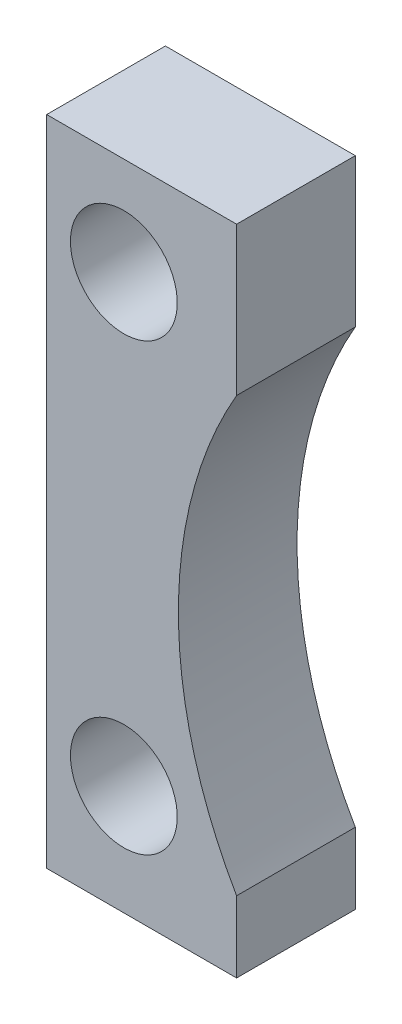
ISO-10303-21;
HEADER;
FILE_DESCRIPTION(('STEP AP214'),'2;1');
FILE_NAME('part.step','',(''),(''),'','','');
FILE_SCHEMA(('AUTOMOTIVE_DESIGN { 1 0 10303 214 1 1 1 1 }'));
ENDSEC;
DATA;
#1=APPLICATION_CONTEXT('core data for automotive mechanical design processes');
#2=APPLICATION_PROTOCOL_DEFINITION('international standard','automotive_design',2000,#1);
#3=PRODUCT_CONTEXT('',#1,'mechanical');
#4=PRODUCT('Part','Part','',(#3));
#5=PRODUCT_RELATED_PRODUCT_CATEGORY('part','',(#4));
#6=PRODUCT_DEFINITION_FORMATION('','',#4);
#7=PRODUCT_DEFINITION_CONTEXT('part definition',#1,'design');
#8=PRODUCT_DEFINITION('design','',#6,#7);
#9=PRODUCT_DEFINITION_SHAPE('','',#8);
#10=(LENGTH_UNIT() NAMED_UNIT(*) SI_UNIT(.MILLI.,.METRE.));
#11=(NAMED_UNIT(*) PLANE_ANGLE_UNIT() SI_UNIT($,.RADIAN.));
#12=(NAMED_UNIT(*) SI_UNIT($,.STERADIAN.) SOLID_ANGLE_UNIT());
#13=UNCERTAINTY_MEASURE_WITH_UNIT(LENGTH_MEASURE(1.E-05),#10,'distance_accuracy_value','');
#14=(GEOMETRIC_REPRESENTATION_CONTEXT(3) GLOBAL_UNCERTAINTY_ASSIGNED_CONTEXT((#13)) GLOBAL_UNIT_ASSIGNED_CONTEXT((#10,
#11,#12)) REPRESENTATION_CONTEXT('',''));
#15=CARTESIAN_POINT('',(0.,0.,0.));
#16=DIRECTION('',(0.,0.,1.));
#17=DIRECTION('',(1.,0.,0.));
#18=AXIS2_PLACEMENT_3D('',#15,#16,#17);
#19=CARTESIAN_POINT('',(0.,110.,10.));
#20=DIRECTION('',(1.,0.,0.));
#21=DIRECTION('',(0.,1.,0.));
#22=AXIS2_PLACEMENT_3D('',#19,#20,#21);
#23=PLANE('',#22);
#24=DIRECTION('',(0.,-1.,0.));
#25=VECTOR('',#24,1.);
#26=CARTESIAN_POINT('',(0.,110.,-10.));
#27=LINE('',#26,#25);
#28=CARTESIAN_POINT('',(0.,110.,-10.));
#29=VERTEX_POINT('',#28);
#30=CARTESIAN_POINT('',(0.,0.,-10.));
#31=VERTEX_POINT('',#30);
#32=EDGE_CURVE('E121',#29,#31,#27,.T.);
#33=ORIENTED_EDGE('',*,*,#32,.T.);
#34=DIRECTION('',(0.,0.,-1.));
#35=VECTOR('',#34,1.);
#36=CARTESIAN_POINT('',(0.,0.,10.));
#37=LINE('',#36,#35);
#38=CARTESIAN_POINT('',(0.,0.,10.));
#39=VERTEX_POINT('',#38);
#40=EDGE_CURVE('E11',#39,#31,#37,.T.);
#41=ORIENTED_EDGE('',*,*,#40,.F.);
#42=DIRECTION('',(0.,-1.,0.));
#43=VECTOR('',#42,1.);
#44=CARTESIAN_POINT('',(0.,110.,10.));
#45=LINE('',#44,#43);
#46=CARTESIAN_POINT('',(0.,110.,10.));
#47=VERTEX_POINT('',#46);
#48=EDGE_CURVE('E132',#47,#39,#45,.T.);
#49=ORIENTED_EDGE('',*,*,#48,.F.);
#50=DIRECTION('',(0.,0.,-1.));
#51=VECTOR('',#50,1.);
#52=CARTESIAN_POINT('',(0.,110.,10.));
#53=LINE('',#52,#51);
#54=EDGE_CURVE('E117',#47,#29,#53,.T.);
#55=ORIENTED_EDGE('',*,*,#54,.T.);
#56=EDGE_LOOP('',(#33,#41,#49,#55));
#57=FACE_BOUND('',#56,.T.);
#58=ADVANCED_FACE('F37',(#57),#23,.F.);
#59=CARTESIAN_POINT('',(0.,0.,10.));
#60=DIRECTION('',(0.,1.,0.));
#61=DIRECTION('',(0.,0.,1.));
#62=AXIS2_PLACEMENT_3D('',#59,#60,#61);
#63=PLANE('',#62);
#64=DIRECTION('',(1.,0.,0.));
#65=VECTOR('',#64,1.);
#66=CARTESIAN_POINT('',(0.,0.,-10.));
#67=LINE('',#66,#65);
#68=CARTESIAN_POINT('',(32.,0.,-10.));
#69=VERTEX_POINT('',#68);
#70=EDGE_CURVE('E124',#31,#69,#67,.T.);
#71=ORIENTED_EDGE('',*,*,#70,.T.);
#72=DIRECTION('',(0.,0.,-1.));
#73=VECTOR('',#72,1.);
#74=CARTESIAN_POINT('',(32.,0.,10.));
#75=LINE('',#74,#73);
#76=CARTESIAN_POINT('',(32.,0.,10.));
#77=VERTEX_POINT('',#76);
#78=EDGE_CURVE('E45',#77,#69,#75,.T.);
#79=ORIENTED_EDGE('',*,*,#78,.F.);
#80=DIRECTION('',(1.,0.,0.));
#81=VECTOR('',#80,1.);
#82=CARTESIAN_POINT('',(0.,0.,10.));
#83=LINE('',#82,#81);
#84=EDGE_CURVE('E90',#39,#77,#83,.T.);
#85=ORIENTED_EDGE('',*,*,#84,.F.);
#86=ORIENTED_EDGE('',*,*,#40,.T.);
#87=EDGE_LOOP('',(#71,#79,#85,#86));
#88=FACE_BOUND('',#87,.T.);
#89=ADVANCED_FACE('F157',(#88),#63,.F.);
#90=CARTESIAN_POINT('',(32.,12.,10.));
#91=DIRECTION('',(-1.,0.,0.));
#92=DIRECTION('',(0.,-1.,0.));
#93=AXIS2_PLACEMENT_3D('',#90,#91,#92);
#94=PLANE('',#93);
#95=DIRECTION('',(0.,1.,0.));
#96=VECTOR('',#95,1.);
#97=CARTESIAN_POINT('',(32.,12.,-10.));
#98=LINE('',#97,#96);
#99=CARTESIAN_POINT('',(32.,12.,-10.));
#100=VERTEX_POINT('',#99);
#101=EDGE_CURVE('E127',#69,#100,#98,.T.);
#102=ORIENTED_EDGE('',*,*,#101,.T.);
#103=DIRECTION('',(0.,0.,-1.));
#104=VECTOR('',#103,1.);
#105=CARTESIAN_POINT('',(32.,12.,10.));
#106=LINE('',#105,#104);
#107=CARTESIAN_POINT('',(32.,12.,10.));
#108=VERTEX_POINT('',#107);
#109=EDGE_CURVE('E112',#108,#100,#106,.T.);
#110=ORIENTED_EDGE('',*,*,#109,.F.);
#111=DIRECTION('',(0.,1.,0.));
#112=VECTOR('',#111,1.);
#113=CARTESIAN_POINT('',(32.,12.,10.));
#114=LINE('',#113,#112);
#115=EDGE_CURVE('E103',#77,#108,#114,.T.);
#116=ORIENTED_EDGE('',*,*,#115,.F.);
#117=ORIENTED_EDGE('',*,*,#78,.T.);
#118=EDGE_LOOP('',(#102,#110,#116,#117));
#119=FACE_BOUND('',#118,.T.);
#120=ADVANCED_FACE('F138',(#119),#94,.F.);
#121=CARTESIAN_POINT('',(95.000000000003,48.5,10.));
#122=DIRECTION('',(0.,0.,-1.));
#123=DIRECTION('',(-1.,0.,0.));
#124=AXIS2_PLACEMENT_3D('',#121,#122,#123);
#125=CYLINDRICAL_SURFACE('',#124,72.8096834219211);
#126=CARTESIAN_POINT('',(95.000000000003,48.5,-10.));
#127=DIRECTION('',(0.,0.,-1.));
#128=DIRECTION('',(1.,0.,0.));
#129=AXIS2_PLACEMENT_3D('',#126,#127,#128);
#130=CIRCLE('',#129,72.8096834219211);
#131=CARTESIAN_POINT('',(32.,85.,-10.));
#132=VERTEX_POINT('',#131);
#133=EDGE_CURVE('E111',#100,#132,#130,.T.);
#134=ORIENTED_EDGE('',*,*,#133,.T.);
#135=DIRECTION('',(0.,0.,-1.));
#136=VECTOR('',#135,1.);
#137=CARTESIAN_POINT('',(32.,85.,10.));
#138=LINE('',#137,#136);
#139=CARTESIAN_POINT('',(32.,85.,10.));
#140=VERTEX_POINT('',#139);
#141=EDGE_CURVE('E108',#140,#132,#138,.T.);
#142=ORIENTED_EDGE('',*,*,#141,.F.);
#143=CARTESIAN_POINT('',(95.000000000003,48.5,10.));
#144=DIRECTION('',(0.,0.,-1.));
#145=DIRECTION('',(1.,0.,0.));
#146=AXIS2_PLACEMENT_3D('',#143,#144,#145);
#147=CIRCLE('',#146,72.8096834219211);
#148=EDGE_CURVE('E97',#108,#140,#147,.T.);
#149=ORIENTED_EDGE('',*,*,#148,.F.);
#150=ORIENTED_EDGE('',*,*,#109,.T.);
#151=EDGE_LOOP('',(#134,#142,#149,#150));
#152=FACE_BOUND('',#151,.T.);
#153=ADVANCED_FACE('F109',(#152),#125,.F.);
#154=CARTESIAN_POINT('',(32.,110.,10.));
#155=DIRECTION('',(-1.,0.,0.));
#156=DIRECTION('',(0.,-1.,0.));
#157=AXIS2_PLACEMENT_3D('',#154,#155,#156);
#158=PLANE('',#157);
#159=DIRECTION('',(0.,1.,0.));
#160=VECTOR('',#159,1.);
#161=CARTESIAN_POINT('',(32.,110.,-10.));
#162=LINE('',#161,#160);
#163=CARTESIAN_POINT('',(32.,110.,-10.));
#164=VERTEX_POINT('',#163);
#165=EDGE_CURVE('E76',#132,#164,#162,.T.);
#166=ORIENTED_EDGE('',*,*,#165,.T.);
#167=DIRECTION('',(0.,0.,-1.));
#168=VECTOR('',#167,1.);
#169=CARTESIAN_POINT('',(32.,110.,10.));
#170=LINE('',#169,#168);
#171=CARTESIAN_POINT('',(32.,110.,10.));
#172=VERTEX_POINT('',#171);
#173=EDGE_CURVE('E113',#172,#164,#170,.T.);
#174=ORIENTED_EDGE('',*,*,#173,.F.);
#175=DIRECTION('',(0.,1.,0.));
#176=VECTOR('',#175,1.);
#177=CARTESIAN_POINT('',(32.,110.,10.));
#178=LINE('',#177,#176);
#179=EDGE_CURVE('E101',#140,#172,#178,.T.);
#180=ORIENTED_EDGE('',*,*,#179,.F.);
#181=ORIENTED_EDGE('',*,*,#141,.T.);
#182=EDGE_LOOP('',(#166,#174,#180,#181));
#183=FACE_BOUND('',#182,.T.);
#184=ADVANCED_FACE('F115',(#183),#158,.F.);
#185=CARTESIAN_POINT('',(0.,110.,10.));
#186=DIRECTION('',(0.,-1.,0.));
#187=DIRECTION('',(0.,0.,-1.));
#188=AXIS2_PLACEMENT_3D('',#185,#186,#187);
#189=PLANE('',#188);
#190=DIRECTION('',(-1.,0.,0.));
#191=VECTOR('',#190,1.);
#192=CARTESIAN_POINT('',(0.,110.,-10.));
#193=LINE('',#192,#191);
#194=EDGE_CURVE('E82',#164,#29,#193,.T.);
#195=ORIENTED_EDGE('',*,*,#194,.T.);
#196=ORIENTED_EDGE('',*,*,#54,.F.);
#197=DIRECTION('',(-1.,0.,0.));
#198=VECTOR('',#197,1.);
#199=CARTESIAN_POINT('',(0.,110.,10.));
#200=LINE('',#199,#198);
#201=EDGE_CURVE('E53',#172,#47,#200,.T.);
#202=ORIENTED_EDGE('',*,*,#201,.F.);
#203=ORIENTED_EDGE('',*,*,#173,.T.);
#204=EDGE_LOOP('',(#195,#196,#202,#203));
#205=FACE_BOUND('',#204,.T.);
#206=ADVANCED_FACE('F145',(#205),#189,.F.);
#207=CARTESIAN_POINT('',(95.000000000003,48.5,10.));
#208=DIRECTION('',(0.,0.,1.));
#209=DIRECTION('',(1.,0.,0.));
#210=AXIS2_PLACEMENT_3D('',#207,#208,#209);
#211=PLANE('',#210);
#212=CARTESIAN_POINT('',(13.000000000003,93.4999999999999,10.));
#213=DIRECTION('',(0.,0.,-1.));
#214=DIRECTION('',(-1.,0.,0.));
#215=AXIS2_PLACEMENT_3D('',#212,#213,#214);
#216=CIRCLE('',#215,9.00000000000002);
#217=CARTESIAN_POINT('',(4.000000000003,93.4999999999999,10.));
#218=VERTEX_POINT('',#217);
#219=EDGE_CURVE('E125',#218,#218,#216,.T.);
#220=ORIENTED_EDGE('',*,*,#219,.T.);
#221=EDGE_LOOP('',(#220));
#222=FACE_BOUND('',#221,.T.);
#223=CARTESIAN_POINT('',(13.000000000003,18.4999999999999,10.));
#224=DIRECTION('',(0.,0.,-1.));
#225=DIRECTION('',(-1.,0.,0.));
#226=AXIS2_PLACEMENT_3D('',#223,#224,#225);
#227=CIRCLE('',#226,9.);
#228=CARTESIAN_POINT('',(4.00000000000302,18.4999999999999,10.));
#229=VERTEX_POINT('',#228);
#230=EDGE_CURVE('E223',#229,#229,#227,.T.);
#231=ORIENTED_EDGE('',*,*,#230,.T.);
#232=EDGE_LOOP('',(#231));
#233=FACE_BOUND('',#232,.T.);
#234=ORIENTED_EDGE('',*,*,#48,.T.);
#235=ORIENTED_EDGE('',*,*,#84,.T.);
#236=ORIENTED_EDGE('',*,*,#115,.T.);
#237=ORIENTED_EDGE('',*,*,#148,.T.);
#238=ORIENTED_EDGE('',*,*,#179,.T.);
#239=ORIENTED_EDGE('',*,*,#201,.T.);
#240=EDGE_LOOP('',(#234,#235,#236,#237,#238,#239));
#241=FACE_BOUND('',#240,.T.);
#242=ADVANCED_FACE('F99',(#222,#233,#241),#211,.T.);
#243=CARTESIAN_POINT('',(95.000000000003,48.5,-10.));
#244=DIRECTION('',(0.,0.,1.));
#245=DIRECTION('',(1.,0.,0.));
#246=AXIS2_PLACEMENT_3D('',#243,#244,#245);
#247=PLANE('',#246);
#248=CARTESIAN_POINT('',(13.000000000003,93.4999999999999,-10.));
#249=DIRECTION('',(0.,0.,-1.));
#250=DIRECTION('',(-1.,0.,0.));
#251=AXIS2_PLACEMENT_3D('',#248,#249,#250);
#252=CIRCLE('',#251,9.00000000000002);
#253=CARTESIAN_POINT('',(4.000000000003,93.4999999999999,-10.));
#254=VERTEX_POINT('',#253);
#255=EDGE_CURVE('E222',#254,#254,#252,.T.);
#256=ORIENTED_EDGE('',*,*,#255,.F.);
#257=EDGE_LOOP('',(#256));
#258=FACE_BOUND('',#257,.T.);
#259=CARTESIAN_POINT('',(13.000000000003,18.4999999999999,-10.));
#260=DIRECTION('',(0.,0.,-1.));
#261=DIRECTION('',(-1.,0.,0.));
#262=AXIS2_PLACEMENT_3D('',#259,#260,#261);
#263=CIRCLE('',#262,9.);
#264=CARTESIAN_POINT('',(4.00000000000302,18.4999999999999,-10.));
#265=VERTEX_POINT('',#264);
#266=EDGE_CURVE('E227',#265,#265,#263,.T.);
#267=ORIENTED_EDGE('',*,*,#266,.F.);
#268=EDGE_LOOP('',(#267));
#269=FACE_BOUND('',#268,.T.);
#270=ORIENTED_EDGE('',*,*,#32,.F.);
#271=ORIENTED_EDGE('',*,*,#194,.F.);
#272=ORIENTED_EDGE('',*,*,#165,.F.);
#273=ORIENTED_EDGE('',*,*,#133,.F.);
#274=ORIENTED_EDGE('',*,*,#101,.F.);
#275=ORIENTED_EDGE('',*,*,#70,.F.);
#276=EDGE_LOOP('',(#270,#271,#272,#273,#274,#275));
#277=FACE_BOUND('',#276,.T.);
#278=ADVANCED_FACE('F141',(#258,#269,#277),#247,.F.);
#279=CARTESIAN_POINT('',(13.000000000003,18.4999999999999,10.));
#280=DIRECTION('',(0.,0.,-1.));
#281=DIRECTION('',(-1.,0.,0.));
#282=AXIS2_PLACEMENT_3D('',#279,#280,#281);
#283=CYLINDRICAL_SURFACE('',#282,9.);
#284=ORIENTED_EDGE('',*,*,#230,.F.);
#285=EDGE_LOOP('',(#284));
#286=FACE_BOUND('',#285,.T.);
#287=ORIENTED_EDGE('',*,*,#266,.T.);
#288=EDGE_LOOP('',(#287));
#289=FACE_BOUND('',#288,.T.);
#290=ADVANCED_FACE('F194',(#286,#289),#283,.F.);
#291=CARTESIAN_POINT('',(13.000000000003,93.4999999999999,10.));
#292=DIRECTION('',(0.,0.,-1.));
#293=DIRECTION('',(-1.,0.,0.));
#294=AXIS2_PLACEMENT_3D('',#291,#292,#293);
#295=CYLINDRICAL_SURFACE('',#294,9.00000000000002);
#296=ORIENTED_EDGE('',*,*,#219,.F.);
#297=EDGE_LOOP('',(#296));
#298=FACE_BOUND('',#297,.T.);
#299=ORIENTED_EDGE('',*,*,#255,.T.);
#300=EDGE_LOOP('',(#299));
#301=FACE_BOUND('',#300,.T.);
#302=ADVANCED_FACE('F203',(#298,#301),#295,.F.);
#303=CLOSED_SHELL('',(#58,#89,#120,#153,#184,#206,#242,#278,#290,#302));
#304=MANIFOLD_SOLID_BREP('B2',#303);
#305=ADVANCED_BREP_SHAPE_REPRESENTATION('',(#18,#304),#14);
#306=SHAPE_DEFINITION_REPRESENTATION(#9,#305);
ENDSEC;
END-ISO-10303-21;
